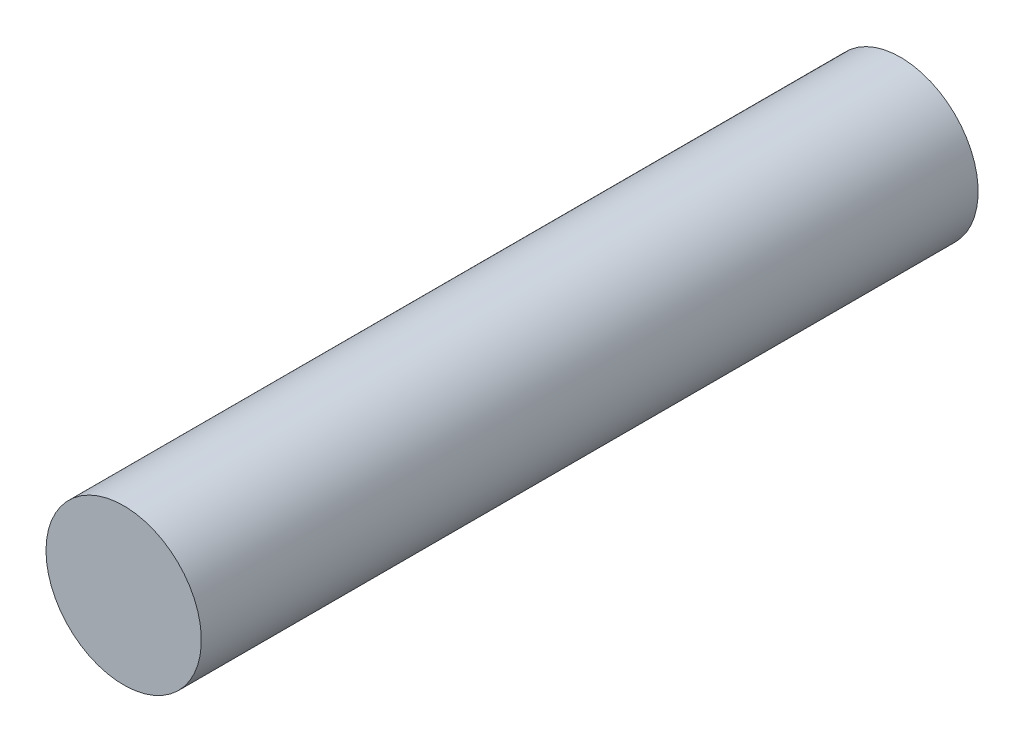
ISO-10303-21;
HEADER;
FILE_DESCRIPTION(('STEP AP214'),'2;1');
FILE_NAME('part.step','',(''),(''),'','','');
FILE_SCHEMA(('AUTOMOTIVE_DESIGN { 1 0 10303 214 1 1 1 1 }'));
ENDSEC;
DATA;
#1=APPLICATION_CONTEXT('core data for automotive mechanical design processes');
#2=APPLICATION_PROTOCOL_DEFINITION('international standard','automotive_design',2000,#1);
#3=PRODUCT_CONTEXT('',#1,'mechanical');
#4=PRODUCT('Part','Part','',(#3));
#5=PRODUCT_RELATED_PRODUCT_CATEGORY('part','',(#4));
#6=PRODUCT_DEFINITION_FORMATION('','',#4);
#7=PRODUCT_DEFINITION_CONTEXT('part definition',#1,'design');
#8=PRODUCT_DEFINITION('design','',#6,#7);
#9=PRODUCT_DEFINITION_SHAPE('','',#8);
#10=(LENGTH_UNIT() NAMED_UNIT(*) SI_UNIT(.MILLI.,.METRE.));
#11=(NAMED_UNIT(*) PLANE_ANGLE_UNIT() SI_UNIT($,.RADIAN.));
#12=(NAMED_UNIT(*) SI_UNIT($,.STERADIAN.) SOLID_ANGLE_UNIT());
#13=UNCERTAINTY_MEASURE_WITH_UNIT(LENGTH_MEASURE(1.E-05),#10,'distance_accuracy_value','');
#14=(GEOMETRIC_REPRESENTATION_CONTEXT(3) GLOBAL_UNCERTAINTY_ASSIGNED_CONTEXT((#13)) GLOBAL_UNIT_ASSIGNED_CONTEXT((#10,
#11,#12)) REPRESENTATION_CONTEXT('',''));
#15=CARTESIAN_POINT('',(0.,0.,0.));
#16=DIRECTION('',(0.,0.,1.));
#17=DIRECTION('',(1.,0.,0.));
#18=AXIS2_PLACEMENT_3D('',#15,#16,#17);
#19=CARTESIAN_POINT('',(0.,0.,76.2));
#20=DIRECTION('',(0.,0.,-1.));
#21=DIRECTION('',(-1.,0.,0.));
#22=AXIS2_PLACEMENT_3D('',#19,#20,#21);
#23=CYLINDRICAL_SURFACE('',#22,7.62);
#24=CARTESIAN_POINT('',(0.,0.,76.2));
#25=DIRECTION('',(0.,0.,1.));
#26=DIRECTION('',(1.,0.,0.));
#27=AXIS2_PLACEMENT_3D('',#24,#25,#26);
#28=CIRCLE('',#27,7.62);
#29=CARTESIAN_POINT('',(-7.62,0.,76.2));
#30=VERTEX_POINT('',#29);
#31=EDGE_CURVE('E10',#30,#30,#28,.T.);
#32=CARTESIAN_POINT('',(0.,0.,0.));
#33=DIRECTION('',(0.,0.,1.));
#34=DIRECTION('',(1.,0.,0.));
#35=AXIS2_PLACEMENT_3D('',#32,#33,#34);
#36=CIRCLE('',#35,7.62);
#37=CARTESIAN_POINT('',(-7.62,0.,0.));
#38=VERTEX_POINT('',#37);
#39=EDGE_CURVE('E37',#38,#38,#36,.T.);
#40=CARTESIAN_POINT('',(-7.62,0.,76.2));
#41=CARTESIAN_POINT('',(-7.62,0.,75.40625));
#42=CARTESIAN_POINT('',(-7.62,0.,74.6125));
#43=CARTESIAN_POINT('',(-7.62,0.,73.025));
#44=CARTESIAN_POINT('',(-7.62,0.,72.23125));
#45=CARTESIAN_POINT('',(-7.62,0.,70.64375));
#46=CARTESIAN_POINT('',(-7.62,0.,69.85));
#47=CARTESIAN_POINT('',(-7.62,0.,68.2625));
#48=CARTESIAN_POINT('',(-7.62,0.,67.46875));
#49=CARTESIAN_POINT('',(-7.62,0.,65.88125));
#50=CARTESIAN_POINT('',(-7.62,0.,65.0875));
#51=CARTESIAN_POINT('',(-7.62,0.,63.5));
#52=CARTESIAN_POINT('',(-7.62,0.,62.70625));
#53=CARTESIAN_POINT('',(-7.62,0.,61.11875));
#54=CARTESIAN_POINT('',(-7.62,0.,60.325));
#55=CARTESIAN_POINT('',(-7.62,0.,58.7375));
#56=CARTESIAN_POINT('',(-7.62,0.,57.94375));
#57=CARTESIAN_POINT('',(-7.62,0.,56.35625));
#58=CARTESIAN_POINT('',(-7.62,0.,55.5625));
#59=CARTESIAN_POINT('',(-7.62,0.,53.975));
#60=CARTESIAN_POINT('',(-7.62,0.,53.18125));
#61=CARTESIAN_POINT('',(-7.62,0.,51.59375));
#62=CARTESIAN_POINT('',(-7.62,0.,50.8));
#63=CARTESIAN_POINT('',(-7.62,0.,49.2125));
#64=CARTESIAN_POINT('',(-7.62,0.,48.41875));
#65=CARTESIAN_POINT('',(-7.62,0.,46.83125));
#66=CARTESIAN_POINT('',(-7.62,0.,46.0375));
#67=CARTESIAN_POINT('',(-7.62,0.,44.45));
#68=CARTESIAN_POINT('',(-7.62,0.,43.65625));
#69=CARTESIAN_POINT('',(-7.62,0.,42.06875));
#70=CARTESIAN_POINT('',(-7.62,0.,41.275));
#71=CARTESIAN_POINT('',(-7.62,0.,39.6875));
#72=CARTESIAN_POINT('',(-7.62,0.,38.89375));
#73=CARTESIAN_POINT('',(-7.62,0.,37.30625));
#74=CARTESIAN_POINT('',(-7.62,0.,36.5125));
#75=CARTESIAN_POINT('',(-7.62,0.,34.925));
#76=CARTESIAN_POINT('',(-7.62,0.,34.13125));
#77=CARTESIAN_POINT('',(-7.62,0.,32.54375));
#78=CARTESIAN_POINT('',(-7.62,0.,31.75));
#79=CARTESIAN_POINT('',(-7.62,0.,30.1625));
#80=CARTESIAN_POINT('',(-7.62,0.,29.36875));
#81=CARTESIAN_POINT('',(-7.62,0.,27.78125));
#82=CARTESIAN_POINT('',(-7.62,0.,26.9875));
#83=CARTESIAN_POINT('',(-7.62,0.,25.4));
#84=CARTESIAN_POINT('',(-7.62,0.,24.60625));
#85=CARTESIAN_POINT('',(-7.62,0.,23.01875));
#86=CARTESIAN_POINT('',(-7.62,0.,22.225));
#87=CARTESIAN_POINT('',(-7.62,0.,20.6375));
#88=CARTESIAN_POINT('',(-7.62,0.,19.84375));
#89=CARTESIAN_POINT('',(-7.62,0.,18.25625));
#90=CARTESIAN_POINT('',(-7.62,0.,17.4625));
#91=CARTESIAN_POINT('',(-7.62,0.,15.875));
#92=CARTESIAN_POINT('',(-7.62,0.,15.08125));
#93=CARTESIAN_POINT('',(-7.62,0.,13.49375));
#94=CARTESIAN_POINT('',(-7.62,0.,12.7));
#95=CARTESIAN_POINT('',(-7.62,0.,11.1125));
#96=CARTESIAN_POINT('',(-7.62,0.,10.31875));
#97=CARTESIAN_POINT('',(-7.62,0.,8.73125));
#98=CARTESIAN_POINT('',(-7.62,0.,7.93750000000001));
#99=CARTESIAN_POINT('',(-7.62,0.,6.35));
#100=CARTESIAN_POINT('',(-7.62,0.,5.55625));
#101=CARTESIAN_POINT('',(-7.62,0.,3.96875));
#102=CARTESIAN_POINT('',(-7.62,0.,3.175));
#103=CARTESIAN_POINT('',(-7.62,0.,1.5875));
#104=CARTESIAN_POINT('',(-7.62,0.,0.793750000000001));
#105=CARTESIAN_POINT('',(-7.62,0.,0.));
#106=B_SPLINE_CURVE_WITH_KNOTS('',3,(#40,#41,#42,#43,#44,#45,#46,#47,#48,#49,#50,#51,#52,#53,
#54,#55,#56,#57,#58,#59,#60,#61,#62,#63,#64,#65,#66,#67,#68,#69,#70,#71,#72,#73,#74,#75,#76,#77,
#78,#79,#80,#81,#82,#83,#84,#85,#86,#87,#88,#89,#90,#91,#92,#93,#94,#95,#96,#97,#98,#99,#100,
#101,#102,#103,#104,#105),.UNSPECIFIED.,.F.,.F.,(4,2,2,2,2,2,2,2,2,2,2,2,2,2,2,2,2,2,2,2,2,2,2,
2,2,2,2,2,2,2,2,2,4),(0.,2.38125,4.7625,7.14375,9.52500000000001,11.90625,14.2875,16.66875,
19.05,21.43125,23.8125,26.19375,28.575,30.95625,33.3375,35.71875,38.1,40.48125,42.8625,45.24375,
47.625,50.00625,52.3875,54.76875,57.15,59.53125,61.9125,64.29375,66.675,69.05625,71.4375,
73.81875,76.2),.UNSPECIFIED.);
#107=EDGE_CURVE('BSEAM34',#30,#38,#106,.T.);
#108=ORIENTED_EDGE('',*,*,#31,.F.);
#109=ORIENTED_EDGE('',*,*,#39,.T.);
#110=ORIENTED_EDGE('',*,*,#107,.T.);
#111=ORIENTED_EDGE('',*,*,#107,.F.);
#112=EDGE_LOOP('',(#108,#110,#109,#111));
#113=FACE_BOUND('',#112,.T.);
#114=ADVANCED_FACE('F34',(#113),#23,.T.);
#115=CARTESIAN_POINT('',(0.,0.,76.2));
#116=DIRECTION('',(0.,0.,1.));
#117=DIRECTION('',(1.,0.,0.));
#118=AXIS2_PLACEMENT_3D('',#115,#116,#117);
#119=PLANE('',#118);
#120=ORIENTED_EDGE('',*,*,#31,.T.);
#121=EDGE_LOOP('',(#120));
#122=FACE_BOUND('',#121,.T.);
#123=ADVANCED_FACE('F49',(#122),#119,.T.);
#124=CARTESIAN_POINT('',(0.,0.,0.));
#125=DIRECTION('',(0.,0.,1.));
#126=DIRECTION('',(1.,0.,0.));
#127=AXIS2_PLACEMENT_3D('',#124,#125,#126);
#128=PLANE('',#127);
#129=ORIENTED_EDGE('',*,*,#39,.F.);
#130=EDGE_LOOP('',(#129));
#131=FACE_BOUND('',#130,.T.);
#132=ADVANCED_FACE('F47',(#131),#128,.F.);
#133=CLOSED_SHELL('',(#114,#123,#132));
#134=MANIFOLD_SOLID_BREP('B2',#133);
#135=ADVANCED_BREP_SHAPE_REPRESENTATION('',(#18,#134),#14);
#136=SHAPE_DEFINITION_REPRESENTATION(#9,#135);
ENDSEC;
END-ISO-10303-21;
